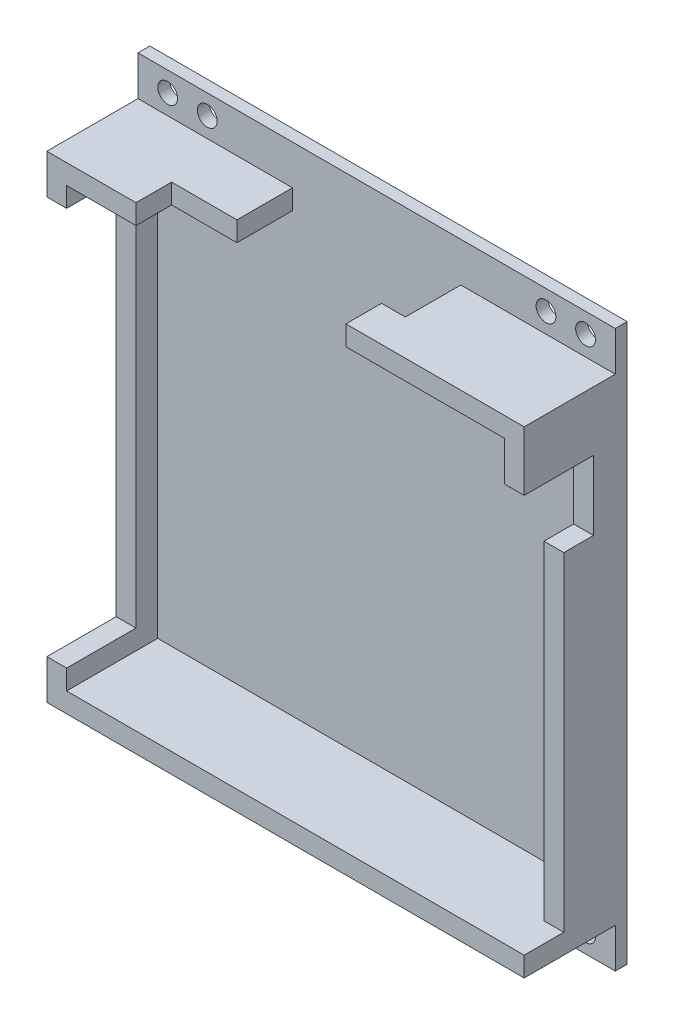
ISO-10303-21;
HEADER;
FILE_DESCRIPTION(('STEP AP214'),'2;1');
FILE_NAME('part.step','',(''),(''),'','','');
FILE_SCHEMA(('AUTOMOTIVE_DESIGN { 1 0 10303 214 1 1 1 1 }'));
ENDSEC;
DATA;
#1=APPLICATION_CONTEXT('core data for automotive mechanical design processes');
#2=APPLICATION_PROTOCOL_DEFINITION('international standard','automotive_design',2000,#1);
#3=PRODUCT_CONTEXT('',#1,'mechanical');
#4=PRODUCT('Part','Part','',(#3));
#5=PRODUCT_RELATED_PRODUCT_CATEGORY('part','',(#4));
#6=PRODUCT_DEFINITION_FORMATION('','',#4);
#7=PRODUCT_DEFINITION_CONTEXT('part definition',#1,'design');
#8=PRODUCT_DEFINITION('design','',#6,#7);
#9=PRODUCT_DEFINITION_SHAPE('','',#8);
#10=(LENGTH_UNIT() NAMED_UNIT(*) SI_UNIT(.MILLI.,.METRE.));
#11=(NAMED_UNIT(*) PLANE_ANGLE_UNIT() SI_UNIT($,.RADIAN.));
#12=(NAMED_UNIT(*) SI_UNIT($,.STERADIAN.) SOLID_ANGLE_UNIT());
#13=UNCERTAINTY_MEASURE_WITH_UNIT(LENGTH_MEASURE(1.E-05),#10,'distance_accuracy_value','');
#14=(GEOMETRIC_REPRESENTATION_CONTEXT(3) GLOBAL_UNCERTAINTY_ASSIGNED_CONTEXT((#13)) GLOBAL_UNIT_ASSIGNED_CONTEXT((#10,
#11,#12)) REPRESENTATION_CONTEXT('',''));
#15=CARTESIAN_POINT('',(0.,0.,0.));
#16=DIRECTION('',(0.,0.,1.));
#17=DIRECTION('',(1.,0.,0.));
#18=AXIS2_PLACEMENT_3D('',#15,#16,#17);
#19=CARTESIAN_POINT('',(-60.25,60.25,23.));
#20=DIRECTION('',(0.,-1.,0.));
#21=DIRECTION('',(0.,0.,-1.));
#22=AXIS2_PLACEMENT_3D('',#19,#20,#21);
#23=PLANE('',#22);
#24=DIRECTION('',(0.,0.,-1.));
#25=VECTOR('',#24,1.);
#26=CARTESIAN_POINT('',(60.25,60.25,23.));
#27=LINE('',#26,#25);
#28=CARTESIAN_POINT('',(60.25,60.25,23.));
#29=VERTEX_POINT('',#28);
#30=CARTESIAN_POINT('',(60.25,60.25,0.));
#31=VERTEX_POINT('',#30);
#32=EDGE_CURVE('E43',#29,#31,#27,.T.);
#33=ORIENTED_EDGE('',*,*,#32,.T.);
#34=DIRECTION('',(-1.,0.,0.));
#35=VECTOR('',#34,1.);
#36=CARTESIAN_POINT('',(-60.25,60.25,0.));
#37=LINE('',#36,#35);
#38=CARTESIAN_POINT('',(21.25,60.25,0.));
#39=VERTEX_POINT('',#38);
#40=EDGE_CURVE('E49',#31,#39,#37,.T.);
#41=ORIENTED_EDGE('',*,*,#40,.T.);
#42=DIRECTION('',(0.,0.,1.));
#43=VECTOR('',#42,1.);
#44=CARTESIAN_POINT('',(21.25,60.25,23.));
#45=LINE('',#44,#43);
#46=CARTESIAN_POINT('',(21.25,60.25,14.));
#47=VERTEX_POINT('',#46);
#48=EDGE_CURVE('E386',#39,#47,#45,.T.);
#49=ORIENTED_EDGE('',*,*,#48,.T.);
#50=DIRECTION('',(-1.,0.,0.));
#51=VECTOR('',#50,1.);
#52=CARTESIAN_POINT('',(-60.25,60.25,14.));
#53=LINE('',#52,#51);
#54=CARTESIAN_POINT('',(15.25,60.25,14.));
#55=VERTEX_POINT('',#54);
#56=EDGE_CURVE('E389',#47,#55,#53,.T.);
#57=ORIENTED_EDGE('',*,*,#56,.T.);
#58=DIRECTION('',(0.,0.,1.));
#59=VECTOR('',#58,1.);
#60=CARTESIAN_POINT('',(15.25,60.25,23.));
#61=LINE('',#60,#59);
#62=CARTESIAN_POINT('',(15.25,60.25,23.));
#63=VERTEX_POINT('',#62);
#64=EDGE_CURVE('E392',#55,#63,#61,.T.);
#65=ORIENTED_EDGE('',*,*,#64,.T.);
#66=DIRECTION('',(-1.,0.,0.));
#67=VECTOR('',#66,1.);
#68=CARTESIAN_POINT('',(-60.25,60.25,23.));
#69=LINE('',#68,#67);
#70=EDGE_CURVE('E463',#29,#63,#69,.T.);
#71=ORIENTED_EDGE('',*,*,#70,.F.);
#72=EDGE_LOOP('',(#33,#41,#49,#57,#65,#71));
#73=FACE_BOUND('',#72,.T.);
#74=ADVANCED_FACE('F39',(#73),#23,.F.);
#75=CARTESIAN_POINT('',(0.,0.,23.));
#76=DIRECTION('',(0.,0.,-1.));
#77=DIRECTION('',(-1.,0.,0.));
#78=AXIS2_PLACEMENT_3D('',#75,#76,#77);
#79=PLANE('',#78);
#80=DIRECTION('',(0.,1.,0.));
#81=VECTOR('',#80,1.);
#82=CARTESIAN_POINT('',(60.25,-60.25,23.));
#83=LINE('',#82,#81);
#84=CARTESIAN_POINT('',(60.25,-60.25,23.));
#85=VERTEX_POINT('',#84);
#86=CARTESIAN_POINT('',(60.25,-55.25,23.));
#87=VERTEX_POINT('',#86);
#88=EDGE_CURVE('E459',#85,#87,#83,.T.);
#89=ORIENTED_EDGE('',*,*,#88,.T.);
#90=DIRECTION('',(1.,0.,0.));
#91=VECTOR('',#90,1.);
#92=CARTESIAN_POINT('',(-55.25,-55.25,23.));
#93=LINE('',#92,#91);
#94=CARTESIAN_POINT('',(-55.25,-55.25,23.));
#95=VERTEX_POINT('',#94);
#96=EDGE_CURVE('E435',#95,#87,#93,.T.);
#97=ORIENTED_EDGE('',*,*,#96,.F.);
#98=DIRECTION('',(0.,-1.,0.));
#99=VECTOR('',#98,1.);
#100=CARTESIAN_POINT('',(-55.25,-55.25,23.));
#101=LINE('',#100,#99);
#102=CARTESIAN_POINT('',(-55.25,-50.25,23.));
#103=VERTEX_POINT('',#102);
#104=EDGE_CURVE('E431',#103,#95,#101,.T.);
#105=ORIENTED_EDGE('',*,*,#104,.F.);
#106=DIRECTION('',(1.,0.,0.));
#107=VECTOR('',#106,1.);
#108=CARTESIAN_POINT('',(-102.25,-50.25,23.));
#109=LINE('',#108,#107);
#110=CARTESIAN_POINT('',(-60.25,-50.25,23.));
#111=VERTEX_POINT('',#110);
#112=EDGE_CURVE('E407',#111,#103,#109,.T.);
#113=ORIENTED_EDGE('',*,*,#112,.F.);
#114=DIRECTION('',(0.,-1.,0.));
#115=VECTOR('',#114,1.);
#116=CARTESIAN_POINT('',(-60.25,-60.25,23.));
#117=LINE('',#116,#115);
#118=CARTESIAN_POINT('',(-60.25,-60.25,23.));
#119=VERTEX_POINT('',#118);
#120=EDGE_CURVE('E466',#111,#119,#117,.T.);
#121=ORIENTED_EDGE('',*,*,#120,.T.);
#122=DIRECTION('',(1.,0.,0.));
#123=VECTOR('',#122,1.);
#124=CARTESIAN_POINT('',(-60.25,-60.25,23.));
#125=LINE('',#124,#123);
#126=EDGE_CURVE('E470',#119,#85,#125,.T.);
#127=ORIENTED_EDGE('',*,*,#126,.T.);
#128=EDGE_LOOP('',(#89,#97,#105,#113,#121,#127));
#129=FACE_BOUND('',#128,.T.);
#130=ADVANCED_FACE('F500',(#129),#79,.F.);
#131=DIRECTION('',(0.,1.,0.));
#132=VECTOR('',#131,1.);
#133=CARTESIAN_POINT('',(55.25,-55.25,23.));
#134=LINE('',#133,#132);
#135=CARTESIAN_POINT('',(55.25,45.25,23.));
#136=VERTEX_POINT('',#135);
#137=CARTESIAN_POINT('',(55.25,55.25,23.));
#138=VERTEX_POINT('',#137);
#139=EDGE_CURVE('E424',#136,#138,#134,.T.);
#140=ORIENTED_EDGE('',*,*,#139,.F.);
#141=DIRECTION('',(-1.,0.,0.));
#142=VECTOR('',#141,1.);
#143=CARTESIAN_POINT('',(102.25,45.25,23.));
#144=LINE('',#143,#142);
#145=CARTESIAN_POINT('',(60.25,45.25,23.));
#146=VERTEX_POINT('',#145);
#147=EDGE_CURVE('E317',#146,#136,#144,.T.);
#148=ORIENTED_EDGE('',*,*,#147,.F.);
#149=EDGE_CURVE('E458',#146,#29,#83,.T.);
#150=ORIENTED_EDGE('',*,*,#149,.T.);
#151=ORIENTED_EDGE('',*,*,#70,.T.);
#152=DIRECTION('',(0.,-1.,0.));
#153=VECTOR('',#152,1.);
#154=CARTESIAN_POINT('',(15.25,102.25,23.));
#155=LINE('',#154,#153);
#156=CARTESIAN_POINT('',(15.25,55.25,23.));
#157=VERTEX_POINT('',#156);
#158=EDGE_CURVE('E360',#63,#157,#155,.T.);
#159=ORIENTED_EDGE('',*,*,#158,.T.);
#160=DIRECTION('',(-1.,0.,0.));
#161=VECTOR('',#160,1.);
#162=CARTESIAN_POINT('',(-55.25,55.25,23.));
#163=LINE('',#162,#161);
#164=EDGE_CURVE('E428',#138,#157,#163,.T.);
#165=ORIENTED_EDGE('',*,*,#164,.F.);
#166=EDGE_LOOP('',(#140,#148,#150,#151,#159,#165));
#167=FACE_BOUND('',#166,.T.);
#168=ADVANCED_FACE('F565',(#167),#79,.F.);
#169=CARTESIAN_POINT('',(-55.25,55.25,23.));
#170=DIRECTION('',(0.,-1.,0.));
#171=DIRECTION('',(0.,0.,-1.));
#172=AXIS2_PLACEMENT_3D('',#169,#170,#171);
#173=PLANE('',#172);
#174=DIRECTION('',(0.,0.,1.));
#175=VECTOR('',#174,1.);
#176=CARTESIAN_POINT('',(15.25,55.25,14.));
#177=LINE('',#176,#175);
#178=CARTESIAN_POINT('',(15.25,55.25,14.));
#179=VERTEX_POINT('',#178);
#180=EDGE_CURVE('E357',#179,#157,#177,.T.);
#181=ORIENTED_EDGE('',*,*,#180,.F.);
#182=DIRECTION('',(-1.,0.,0.));
#183=VECTOR('',#182,1.);
#184=CARTESIAN_POINT('',(15.25,55.25,14.));
#185=LINE('',#184,#183);
#186=CARTESIAN_POINT('',(21.25,55.25,14.));
#187=VERTEX_POINT('',#186);
#188=EDGE_CURVE('E354',#187,#179,#185,.T.);
#189=ORIENTED_EDGE('',*,*,#188,.F.);
#190=DIRECTION('',(0.,0.,1.));
#191=VECTOR('',#190,1.);
#192=CARTESIAN_POINT('',(21.25,55.25,14.));
#193=LINE('',#192,#191);
#194=CARTESIAN_POINT('',(21.25,55.25,0.));
#195=VERTEX_POINT('',#194);
#196=EDGE_CURVE('E351',#195,#187,#193,.T.);
#197=ORIENTED_EDGE('',*,*,#196,.F.);
#198=DIRECTION('',(-1.,0.,0.));
#199=VECTOR('',#198,1.);
#200=CARTESIAN_POINT('',(-55.25,55.25,0.));
#201=LINE('',#200,#199);
#202=CARTESIAN_POINT('',(55.25,55.25,0.));
#203=VERTEX_POINT('',#202);
#204=EDGE_CURVE('E441',#203,#195,#201,.T.);
#205=ORIENTED_EDGE('',*,*,#204,.F.);
#206=DIRECTION('',(0.,0.,-1.));
#207=VECTOR('',#206,1.);
#208=CARTESIAN_POINT('',(55.25,55.25,23.));
#209=LINE('',#208,#207);
#210=EDGE_CURVE('E455',#138,#203,#209,.T.);
#211=ORIENTED_EDGE('',*,*,#210,.F.);
#212=ORIENTED_EDGE('',*,*,#164,.T.);
#213=EDGE_LOOP('',(#181,#189,#197,#205,#211,#212));
#214=FACE_BOUND('',#213,.T.);
#215=ADVANCED_FACE('F552',(#214),#173,.T.);
#216=CARTESIAN_POINT('',(-37.75,55.25,23.));
#217=VERTEX_POINT('',#216);
#218=CARTESIAN_POINT('',(-55.25,55.25,23.));
#219=VERTEX_POINT('',#218);
#220=EDGE_CURVE('E426',#217,#219,#163,.T.);
#221=ORIENTED_EDGE('',*,*,#220,.F.);
#222=DIRECTION('',(0.,-1.,0.));
#223=VECTOR('',#222,1.);
#224=CARTESIAN_POINT('',(-37.75,102.25,23.));
#225=LINE('',#224,#223);
#226=CARTESIAN_POINT('',(-37.75,60.25,23.));
#227=VERTEX_POINT('',#226);
#228=EDGE_CURVE('E359',#227,#217,#225,.T.);
#229=ORIENTED_EDGE('',*,*,#228,.F.);
#230=CARTESIAN_POINT('',(-60.25,60.25,23.));
#231=VERTEX_POINT('',#230);
#232=EDGE_CURVE('E462',#227,#231,#69,.T.);
#233=ORIENTED_EDGE('',*,*,#232,.T.);
#234=CARTESIAN_POINT('',(-60.25,50.25,23.));
#235=VERTEX_POINT('',#234);
#236=EDGE_CURVE('E467',#231,#235,#117,.T.);
#237=ORIENTED_EDGE('',*,*,#236,.T.);
#238=DIRECTION('',(1.,0.,0.));
#239=VECTOR('',#238,1.);
#240=CARTESIAN_POINT('',(-102.25,50.25,23.));
#241=LINE('',#240,#239);
#242=CARTESIAN_POINT('',(-55.25,50.25,23.));
#243=VERTEX_POINT('',#242);
#244=EDGE_CURVE('E404',#235,#243,#241,.T.);
#245=ORIENTED_EDGE('',*,*,#244,.T.);
#246=EDGE_CURVE('E432',#219,#243,#101,.T.);
#247=ORIENTED_EDGE('',*,*,#246,.F.);
#248=EDGE_LOOP('',(#221,#229,#233,#237,#245,#247));
#249=FACE_BOUND('',#248,.T.);
#250=ADVANCED_FACE('F518',(#249),#79,.F.);
#251=CARTESIAN_POINT('',(-60.25,-60.25,23.));
#252=DIRECTION('',(1.,0.,0.));
#253=DIRECTION('',(0.,0.,-1.));
#254=AXIS2_PLACEMENT_3D('',#251,#252,#253);
#255=PLANE('',#254);
#256=DIRECTION('',(0.,0.,-1.));
#257=VECTOR('',#256,1.);
#258=CARTESIAN_POINT('',(-60.25,50.25,23.));
#259=LINE('',#258,#257);
#260=CARTESIAN_POINT('',(-60.25,50.25,5.5));
#261=VERTEX_POINT('',#260);
#262=EDGE_CURVE('E417',#235,#261,#259,.T.);
#263=ORIENTED_EDGE('',*,*,#262,.F.);
#264=ORIENTED_EDGE('',*,*,#236,.F.);
#265=DIRECTION('',(0.,0.,-1.));
#266=VECTOR('',#265,1.);
#267=CARTESIAN_POINT('',(-60.25,60.25,23.));
#268=LINE('',#267,#266);
#269=CARTESIAN_POINT('',(-60.25,60.25,0.));
#270=VERTEX_POINT('',#269);
#271=EDGE_CURVE('E255',#231,#270,#268,.T.);
#272=ORIENTED_EDGE('',*,*,#271,.T.);
#273=DIRECTION('',(0.,1.,0.));
#274=VECTOR('',#273,1.);
#275=CARTESIAN_POINT('',(-60.25,70.25,0.));
#276=LINE('',#275,#274);
#277=CARTESIAN_POINT('',(-60.25,70.25,0.));
#278=VERTEX_POINT('',#277);
#279=EDGE_CURVE('E56',#270,#278,#276,.T.);
#280=ORIENTED_EDGE('',*,*,#279,.T.);
#281=DIRECTION('',(0.,0.,-1.));
#282=VECTOR('',#281,1.);
#283=CARTESIAN_POINT('',(-60.25,70.25,0.));
#284=LINE('',#283,#282);
#285=CARTESIAN_POINT('',(-60.25,70.25,-3.));
#286=VERTEX_POINT('',#285);
#287=EDGE_CURVE('E234',#278,#286,#284,.T.);
#288=ORIENTED_EDGE('',*,*,#287,.T.);
#289=DIRECTION('',(0.,1.,0.));
#290=VECTOR('',#289,1.);
#291=CARTESIAN_POINT('',(-60.25,-60.25,-3.));
#292=LINE('',#291,#290);
#293=CARTESIAN_POINT('',(-60.25,-70.25,-3.));
#294=VERTEX_POINT('',#293);
#295=EDGE_CURVE('E419',#294,#286,#292,.T.);
#296=ORIENTED_EDGE('',*,*,#295,.F.);
#297=DIRECTION('',(0.,0.,-1.));
#298=VECTOR('',#297,1.);
#299=CARTESIAN_POINT('',(-60.25,-70.25,0.));
#300=LINE('',#299,#298);
#301=CARTESIAN_POINT('',(-60.25,-70.25,0.));
#302=VERTEX_POINT('',#301);
#303=EDGE_CURVE('E268',#302,#294,#300,.T.);
#304=ORIENTED_EDGE('',*,*,#303,.F.);
#305=DIRECTION('',(0.,1.,0.));
#306=VECTOR('',#305,1.);
#307=CARTESIAN_POINT('',(-60.25,-70.25,0.));
#308=LINE('',#307,#306);
#309=CARTESIAN_POINT('',(-60.25,-60.25,0.));
#310=VERTEX_POINT('',#309);
#311=EDGE_CURVE('E267',#302,#310,#308,.T.);
#312=ORIENTED_EDGE('',*,*,#311,.T.);
#313=DIRECTION('',(0.,0.,-1.));
#314=VECTOR('',#313,1.);
#315=CARTESIAN_POINT('',(-60.25,-60.25,23.));
#316=LINE('',#315,#314);
#317=EDGE_CURVE('E475',#119,#310,#316,.T.);
#318=ORIENTED_EDGE('',*,*,#317,.F.);
#319=ORIENTED_EDGE('',*,*,#120,.F.);
#320=DIRECTION('',(0.,0.,1.));
#321=VECTOR('',#320,1.);
#322=CARTESIAN_POINT('',(-60.25,-50.25,23.));
#323=LINE('',#322,#321);
#324=CARTESIAN_POINT('',(-60.25,-50.25,5.49999999999999));
#325=VERTEX_POINT('',#324);
#326=EDGE_CURVE('E413',#325,#111,#323,.T.);
#327=ORIENTED_EDGE('',*,*,#326,.F.);
#328=DIRECTION('',(0.,-1.,0.));
#329=VECTOR('',#328,1.);
#330=CARTESIAN_POINT('',(-60.25,-60.25,5.49999999999998));
#331=LINE('',#330,#329);
#332=EDGE_CURVE('E415',#261,#325,#331,.T.);
#333=ORIENTED_EDGE('',*,*,#332,.F.);
#334=EDGE_LOOP('',(#263,#264,#272,#280,#288,#296,#304,#312,#318,#319,#327,#333));
#335=FACE_BOUND('',#334,.T.);
#336=ADVANCED_FACE('F252',(#335),#255,.F.);
#337=CARTESIAN_POINT('',(-55.25,-55.25,23.));
#338=DIRECTION('',(1.,0.,0.));
#339=DIRECTION('',(0.,0.,-1.));
#340=AXIS2_PLACEMENT_3D('',#337,#338,#339);
#341=PLANE('',#340);
#342=ORIENTED_EDGE('',*,*,#246,.T.);
#343=DIRECTION('',(0.,0.,-1.));
#344=VECTOR('',#343,1.);
#345=CARTESIAN_POINT('',(-55.25,50.25,23.));
#346=LINE('',#345,#344);
#347=CARTESIAN_POINT('',(-55.25,50.25,5.5));
#348=VERTEX_POINT('',#347);
#349=EDGE_CURVE('E395',#243,#348,#346,.T.);
#350=ORIENTED_EDGE('',*,*,#349,.T.);
#351=DIRECTION('',(0.,-1.,0.));
#352=VECTOR('',#351,1.);
#353=CARTESIAN_POINT('',(-55.25,50.25,5.5));
#354=LINE('',#353,#352);
#355=CARTESIAN_POINT('',(-55.25,-50.25,5.49999999999999));
#356=VERTEX_POINT('',#355);
#357=EDGE_CURVE('E398',#348,#356,#354,.T.);
#358=ORIENTED_EDGE('',*,*,#357,.T.);
#359=DIRECTION('',(0.,0.,1.));
#360=VECTOR('',#359,1.);
#361=CARTESIAN_POINT('',(-55.25,-50.25,5.49999999999999));
#362=LINE('',#361,#360);
#363=EDGE_CURVE('E401',#356,#103,#362,.T.);
#364=ORIENTED_EDGE('',*,*,#363,.T.);
#365=ORIENTED_EDGE('',*,*,#104,.T.);
#366=DIRECTION('',(0.,0.,-1.));
#367=VECTOR('',#366,1.);
#368=CARTESIAN_POINT('',(-55.25,-55.25,23.));
#369=LINE('',#368,#367);
#370=CARTESIAN_POINT('',(-55.25,-55.25,0.));
#371=VERTEX_POINT('',#370);
#372=EDGE_CURVE('E449',#95,#371,#369,.T.);
#373=ORIENTED_EDGE('',*,*,#372,.T.);
#374=DIRECTION('',(0.,-1.,0.));
#375=VECTOR('',#374,1.);
#376=CARTESIAN_POINT('',(-55.25,-55.25,0.));
#377=LINE('',#376,#375);
#378=CARTESIAN_POINT('',(-55.25,55.25,0.));
#379=VERTEX_POINT('',#378);
#380=EDGE_CURVE('E444',#379,#371,#377,.T.);
#381=ORIENTED_EDGE('',*,*,#380,.F.);
#382=DIRECTION('',(0.,0.,-1.));
#383=VECTOR('',#382,1.);
#384=CARTESIAN_POINT('',(-55.25,55.25,23.));
#385=LINE('',#384,#383);
#386=EDGE_CURVE('E452',#219,#379,#385,.T.);
#387=ORIENTED_EDGE('',*,*,#386,.F.);
#388=EDGE_LOOP('',(#342,#350,#358,#364,#365,#373,#381,#387));
#389=FACE_BOUND('',#388,.T.);
#390=ADVANCED_FACE('F537',(#389),#341,.T.);
#391=CARTESIAN_POINT('',(60.25,-60.25,23.));
#392=DIRECTION('',(-1.,0.,0.));
#393=DIRECTION('',(0.,0.,1.));
#394=AXIS2_PLACEMENT_3D('',#391,#392,#393);
#395=PLANE('',#394);
#396=DIRECTION('',(0.,-1.,0.));
#397=VECTOR('',#396,1.);
#398=CARTESIAN_POINT('',(60.25,-60.25,13.));
#399=LINE('',#398,#397);
#400=CARTESIAN_POINT('',(60.25,27.75,13.));
#401=VERTEX_POINT('',#400);
#402=CARTESIAN_POINT('',(60.25,-55.25,13.));
#403=VERTEX_POINT('',#402);
#404=EDGE_CURVE('E337',#401,#403,#399,.T.);
#405=ORIENTED_EDGE('',*,*,#404,.T.);
#406=DIRECTION('',(0.,0.,1.));
#407=VECTOR('',#406,1.);
#408=CARTESIAN_POINT('',(60.25,-55.25,23.));
#409=LINE('',#408,#407);
#410=EDGE_CURVE('E340',#403,#87,#409,.T.);
#411=ORIENTED_EDGE('',*,*,#410,.T.);
#412=ORIENTED_EDGE('',*,*,#88,.F.);
#413=DIRECTION('',(0.,0.,-1.));
#414=VECTOR('',#413,1.);
#415=CARTESIAN_POINT('',(60.25,-60.25,23.));
#416=LINE('',#415,#414);
#417=CARTESIAN_POINT('',(60.25,-60.25,0.));
#418=VERTEX_POINT('',#417);
#419=EDGE_CURVE('E472',#85,#418,#416,.T.);
#420=ORIENTED_EDGE('',*,*,#419,.T.);
#421=DIRECTION('',(0.,-1.,0.));
#422=VECTOR('',#421,1.);
#423=CARTESIAN_POINT('',(60.25,-60.25,0.));
#424=LINE('',#423,#422);
#425=CARTESIAN_POINT('',(60.25,-70.25,0.));
#426=VERTEX_POINT('',#425);
#427=EDGE_CURVE('E63',#418,#426,#424,.T.);
#428=ORIENTED_EDGE('',*,*,#427,.T.);
#429=DIRECTION('',(0.,0.,-1.));
#430=VECTOR('',#429,1.);
#431=CARTESIAN_POINT('',(60.25,-70.25,0.));
#432=LINE('',#431,#430);
#433=CARTESIAN_POINT('',(60.25,-70.25,-3.));
#434=VERTEX_POINT('',#433);
#435=EDGE_CURVE('E264',#426,#434,#432,.T.);
#436=ORIENTED_EDGE('',*,*,#435,.T.);
#437=DIRECTION('',(0.,-1.,0.));
#438=VECTOR('',#437,1.);
#439=CARTESIAN_POINT('',(60.25,-60.25,-3.));
#440=LINE('',#439,#438);
#441=CARTESIAN_POINT('',(60.25,70.25,-3.));
#442=VERTEX_POINT('',#441);
#443=EDGE_CURVE('E421',#442,#434,#440,.T.);
#444=ORIENTED_EDGE('',*,*,#443,.F.);
#445=DIRECTION('',(0.,0.,-1.));
#446=VECTOR('',#445,1.);
#447=CARTESIAN_POINT('',(60.25,70.25,0.));
#448=LINE('',#447,#446);
#449=CARTESIAN_POINT('',(60.25,70.25,0.));
#450=VERTEX_POINT('',#449);
#451=EDGE_CURVE('E242',#450,#442,#448,.T.);
#452=ORIENTED_EDGE('',*,*,#451,.F.);
#453=DIRECTION('',(0.,-1.,0.));
#454=VECTOR('',#453,1.);
#455=CARTESIAN_POINT('',(60.25,60.25,0.));
#456=LINE('',#455,#454);
#457=EDGE_CURVE('E243',#450,#31,#456,.T.);
#458=ORIENTED_EDGE('',*,*,#457,.T.);
#459=ORIENTED_EDGE('',*,*,#32,.F.);
#460=ORIENTED_EDGE('',*,*,#149,.F.);
#461=DIRECTION('',(0.,0.,-1.));
#462=VECTOR('',#461,1.);
#463=CARTESIAN_POINT('',(60.25,45.25,23.));
#464=LINE('',#463,#462);
#465=CARTESIAN_POINT('',(60.25,45.25,5.5));
#466=VERTEX_POINT('',#465);
#467=EDGE_CURVE('E321',#146,#466,#464,.T.);
#468=ORIENTED_EDGE('',*,*,#467,.T.);
#469=DIRECTION('',(0.,-1.,0.));
#470=VECTOR('',#469,1.);
#471=CARTESIAN_POINT('',(60.25,-60.25,5.50000000000001));
#472=LINE('',#471,#470);
#473=CARTESIAN_POINT('',(60.25,27.75,5.5));
#474=VERTEX_POINT('',#473);
#475=EDGE_CURVE('E331',#466,#474,#472,.T.);
#476=ORIENTED_EDGE('',*,*,#475,.T.);
#477=DIRECTION('',(0.,0.,1.));
#478=VECTOR('',#477,1.);
#479=CARTESIAN_POINT('',(60.25,27.75,23.));
#480=LINE('',#479,#478);
#481=EDGE_CURVE('E334',#474,#401,#480,.T.);
#482=ORIENTED_EDGE('',*,*,#481,.T.);
#483=EDGE_LOOP('',(#405,#411,#412,#420,#428,#436,#444,#452,#458,#459,#460,#468,#476,#482));
#484=FACE_BOUND('',#483,.T.);
#485=ADVANCED_FACE('F41',(#484),#395,.F.);
#486=DIRECTION('',(0.,0.,-1.));
#487=VECTOR('',#486,1.);
#488=CARTESIAN_POINT('',(-21.25,60.25,23.));
#489=LINE('',#488,#487);
#490=CARTESIAN_POINT('',(-21.25,60.25,14.));
#491=VERTEX_POINT('',#490);
#492=CARTESIAN_POINT('',(-21.25,60.25,0.));
#493=VERTEX_POINT('',#492);
#494=EDGE_CURVE('E383',#491,#493,#489,.T.);
#495=ORIENTED_EDGE('',*,*,#494,.T.);
#496=EDGE_CURVE('E11',#493,#270,#37,.T.);
#497=ORIENTED_EDGE('',*,*,#496,.T.);
#498=ORIENTED_EDGE('',*,*,#271,.F.);
#499=ORIENTED_EDGE('',*,*,#232,.F.);
#500=DIRECTION('',(0.,0.,-1.));
#501=VECTOR('',#500,1.);
#502=CARTESIAN_POINT('',(-37.75,60.25,23.));
#503=LINE('',#502,#501);
#504=CARTESIAN_POINT('',(-37.75,60.25,14.));
#505=VERTEX_POINT('',#504);
#506=EDGE_CURVE('E363',#227,#505,#503,.T.);
#507=ORIENTED_EDGE('',*,*,#506,.T.);
#508=DIRECTION('',(1.,0.,0.));
#509=VECTOR('',#508,1.);
#510=CARTESIAN_POINT('',(-60.25,60.25,14.));
#511=LINE('',#510,#509);
#512=EDGE_CURVE('E380',#505,#491,#511,.T.);
#513=ORIENTED_EDGE('',*,*,#512,.T.);
#514=EDGE_LOOP('',(#495,#497,#498,#499,#507,#513));
#515=FACE_BOUND('',#514,.T.);
#516=ADVANCED_FACE('F523',(#515),#23,.F.);
#517=CARTESIAN_POINT('',(-60.25,-60.25,23.));
#518=DIRECTION('',(0.,1.,0.));
#519=DIRECTION('',(0.,0.,1.));
#520=AXIS2_PLACEMENT_3D('',#517,#518,#519);
#521=PLANE('',#520);
#522=ORIENTED_EDGE('',*,*,#317,.T.);
#523=DIRECTION('',(1.,0.,0.));
#524=VECTOR('',#523,1.);
#525=CARTESIAN_POINT('',(-60.25,-60.25,0.));
#526=LINE('',#525,#524);
#527=EDGE_CURVE('E275',#310,#418,#526,.T.);
#528=ORIENTED_EDGE('',*,*,#527,.T.);
#529=ORIENTED_EDGE('',*,*,#419,.F.);
#530=ORIENTED_EDGE('',*,*,#126,.F.);
#531=EDGE_LOOP('',(#522,#528,#529,#530));
#532=FACE_BOUND('',#531,.T.);
#533=ADVANCED_FACE('F496',(#532),#521,.F.);
#534=CARTESIAN_POINT('',(55.25,-55.25,23.));
#535=DIRECTION('',(-1.,0.,0.));
#536=DIRECTION('',(0.,0.,1.));
#537=AXIS2_PLACEMENT_3D('',#534,#535,#536);
#538=PLANE('',#537);
#539=DIRECTION('',(0.,-1.,0.));
#540=VECTOR('',#539,1.);
#541=CARTESIAN_POINT('',(55.25,27.75,13.));
#542=LINE('',#541,#540);
#543=CARTESIAN_POINT('',(55.25,27.75,13.));
#544=VERTEX_POINT('',#543);
#545=CARTESIAN_POINT('',(55.25,-55.25,13.));
#546=VERTEX_POINT('',#545);
#547=EDGE_CURVE('E315',#544,#546,#542,.T.);
#548=ORIENTED_EDGE('',*,*,#547,.F.);
#549=DIRECTION('',(0.,0.,1.));
#550=VECTOR('',#549,1.);
#551=CARTESIAN_POINT('',(55.25,27.75,5.5));
#552=LINE('',#551,#550);
#553=CARTESIAN_POINT('',(55.25,27.75,5.5));
#554=VERTEX_POINT('',#553);
#555=EDGE_CURVE('E312',#554,#544,#552,.T.);
#556=ORIENTED_EDGE('',*,*,#555,.F.);
#557=DIRECTION('',(0.,-1.,0.));
#558=VECTOR('',#557,1.);
#559=CARTESIAN_POINT('',(55.25,45.25,5.5));
#560=LINE('',#559,#558);
#561=CARTESIAN_POINT('',(55.25,45.25,5.5));
#562=VERTEX_POINT('',#561);
#563=EDGE_CURVE('E309',#562,#554,#560,.T.);
#564=ORIENTED_EDGE('',*,*,#563,.F.);
#565=DIRECTION('',(0.,0.,-1.));
#566=VECTOR('',#565,1.);
#567=CARTESIAN_POINT('',(55.25,45.25,23.));
#568=LINE('',#567,#566);
#569=EDGE_CURVE('E262',#136,#562,#568,.T.);
#570=ORIENTED_EDGE('',*,*,#569,.F.);
#571=ORIENTED_EDGE('',*,*,#139,.T.);
#572=ORIENTED_EDGE('',*,*,#210,.T.);
#573=DIRECTION('',(0.,1.,0.));
#574=VECTOR('',#573,1.);
#575=CARTESIAN_POINT('',(55.25,-55.25,0.));
#576=LINE('',#575,#574);
#577=CARTESIAN_POINT('',(55.25,-55.25,0.));
#578=VERTEX_POINT('',#577);
#579=EDGE_CURVE('E423',#578,#203,#576,.T.);
#580=ORIENTED_EDGE('',*,*,#579,.F.);
#581=DIRECTION('',(0.,0.,-1.));
#582=VECTOR('',#581,1.);
#583=CARTESIAN_POINT('',(55.25,-55.25,23.));
#584=LINE('',#583,#582);
#585=EDGE_CURVE('E437',#546,#578,#584,.T.);
#586=ORIENTED_EDGE('',*,*,#585,.F.);
#587=EDGE_LOOP('',(#548,#556,#564,#570,#571,#572,#580,#586));
#588=FACE_BOUND('',#587,.T.);
#589=ADVANCED_FACE('F546',(#588),#538,.T.);
#590=DIRECTION('',(0.,0.,-1.));
#591=VECTOR('',#590,1.);
#592=CARTESIAN_POINT('',(-21.25,55.25,0.));
#593=LINE('',#592,#591);
#594=CARTESIAN_POINT('',(-21.25,55.25,14.));
#595=VERTEX_POINT('',#594);
#596=CARTESIAN_POINT('',(-21.25,55.25,0.));
#597=VERTEX_POINT('',#596);
#598=EDGE_CURVE('E349',#595,#597,#593,.T.);
#599=ORIENTED_EDGE('',*,*,#598,.F.);
#600=DIRECTION('',(1.,0.,0.));
#601=VECTOR('',#600,1.);
#602=CARTESIAN_POINT('',(-37.75,55.25,14.));
#603=LINE('',#602,#601);
#604=CARTESIAN_POINT('',(-37.75,55.25,14.));
#605=VERTEX_POINT('',#604);
#606=EDGE_CURVE('E346',#605,#595,#603,.T.);
#607=ORIENTED_EDGE('',*,*,#606,.F.);
#608=DIRECTION('',(0.,0.,-1.));
#609=VECTOR('',#608,1.);
#610=CARTESIAN_POINT('',(-37.75,55.25,23.));
#611=LINE('',#610,#609);
#612=EDGE_CURVE('E343',#217,#605,#611,.T.);
#613=ORIENTED_EDGE('',*,*,#612,.F.);
#614=ORIENTED_EDGE('',*,*,#220,.T.);
#615=ORIENTED_EDGE('',*,*,#386,.T.);
#616=EDGE_CURVE('E440',#597,#379,#201,.T.);
#617=ORIENTED_EDGE('',*,*,#616,.F.);
#618=EDGE_LOOP('',(#599,#607,#613,#614,#615,#617));
#619=FACE_BOUND('',#618,.T.);
#620=ADVANCED_FACE('F532',(#619),#173,.T.);
#621=CARTESIAN_POINT('',(-55.25,-55.25,23.));
#622=DIRECTION('',(0.,1.,0.));
#623=DIRECTION('',(0.,0.,1.));
#624=AXIS2_PLACEMENT_3D('',#621,#622,#623);
#625=PLANE('',#624);
#626=DIRECTION('',(1.,0.,0.));
#627=VECTOR('',#626,1.);
#628=CARTESIAN_POINT('',(-55.25,-55.25,0.));
#629=LINE('',#628,#627);
#630=EDGE_CURVE('E427',#371,#578,#629,.T.);
#631=ORIENTED_EDGE('',*,*,#630,.F.);
#632=ORIENTED_EDGE('',*,*,#372,.F.);
#633=ORIENTED_EDGE('',*,*,#96,.T.);
#634=ORIENTED_EDGE('',*,*,#410,.F.);
#635=DIRECTION('',(-1.,0.,0.));
#636=VECTOR('',#635,1.);
#637=CARTESIAN_POINT('',(102.25,-55.25,13.));
#638=LINE('',#637,#636);
#639=EDGE_CURVE('E318',#403,#546,#638,.T.);
#640=ORIENTED_EDGE('',*,*,#639,.T.);
#641=ORIENTED_EDGE('',*,*,#585,.T.);
#642=EDGE_LOOP('',(#631,#632,#633,#634,#640,#641));
#643=FACE_BOUND('',#642,.T.);
#644=ADVANCED_FACE('F540',(#643),#625,.T.);
#645=CARTESIAN_POINT('',(0.,0.,0.));
#646=DIRECTION('',(0.,0.,1.));
#647=DIRECTION('',(1.,0.,0.));
#648=AXIS2_PLACEMENT_3D('',#645,#646,#647);
#649=PLANE('',#648);
#650=ORIENTED_EDGE('',*,*,#380,.T.);
#651=ORIENTED_EDGE('',*,*,#630,.T.);
#652=ORIENTED_EDGE('',*,*,#579,.T.);
#653=ORIENTED_EDGE('',*,*,#204,.T.);
#654=DIRECTION('',(0.,-1.,0.));
#655=VECTOR('',#654,1.);
#656=CARTESIAN_POINT('',(21.25,102.25,0.));
#657=LINE('',#656,#655);
#658=EDGE_CURVE('E368',#39,#195,#657,.T.);
#659=ORIENTED_EDGE('',*,*,#658,.F.);
#660=ORIENTED_EDGE('',*,*,#40,.F.);
#661=ORIENTED_EDGE('',*,*,#457,.F.);
#662=DIRECTION('',(1.,0.,0.));
#663=VECTOR('',#662,1.);
#664=CARTESIAN_POINT('',(60.25,70.25,0.));
#665=LINE('',#664,#663);
#666=EDGE_CURVE('E237',#278,#450,#665,.T.);
#667=ORIENTED_EDGE('',*,*,#666,.F.);
#668=ORIENTED_EDGE('',*,*,#279,.F.);
#669=ORIENTED_EDGE('',*,*,#496,.F.);
#670=DIRECTION('',(0.,-1.,0.));
#671=VECTOR('',#670,1.);
#672=CARTESIAN_POINT('',(-21.25,102.25,0.));
#673=LINE('',#672,#671);
#674=EDGE_CURVE('E370',#493,#597,#673,.T.);
#675=ORIENTED_EDGE('',*,*,#674,.T.);
#676=ORIENTED_EDGE('',*,*,#616,.T.);
#677=EDGE_LOOP('',(#650,#651,#652,#653,#659,#660,#661,#667,#668,#669,#675,#676));
#678=FACE_BOUND('',#677,.T.);
#679=CARTESIAN_POINT('',(-42.75,65.25,0.));
#680=DIRECTION('',(0.,0.,-1.));
#681=DIRECTION('',(-1.,0.,0.));
#682=AXIS2_PLACEMENT_3D('',#679,#680,#681);
#683=CIRCLE('',#682,2.5);
#684=CARTESIAN_POINT('',(-45.25,65.25,0.));
#685=VERTEX_POINT('',#684);
#686=EDGE_CURVE('E837',#685,#685,#683,.T.);
#687=ORIENTED_EDGE('',*,*,#686,.T.);
#688=EDGE_LOOP('',(#687));
#689=FACE_BOUND('',#688,.T.);
#690=CARTESIAN_POINT('',(-52.75,65.25,0.));
#691=DIRECTION('',(0.,0.,-1.));
#692=DIRECTION('',(-1.,0.,0.));
#693=AXIS2_PLACEMENT_3D('',#690,#691,#692);
#694=CIRCLE('',#693,2.5);
#695=CARTESIAN_POINT('',(-55.25,65.25,0.));
#696=VERTEX_POINT('',#695);
#697=EDGE_CURVE('E845',#696,#696,#694,.T.);
#698=ORIENTED_EDGE('',*,*,#697,.T.);
#699=EDGE_LOOP('',(#698));
#700=FACE_BOUND('',#699,.T.);
#701=CARTESIAN_POINT('',(42.75,65.25,0.));
#702=DIRECTION('',(0.,0.,-1.));
#703=DIRECTION('',(-1.,0.,0.));
#704=AXIS2_PLACEMENT_3D('',#701,#702,#703);
#705=CIRCLE('',#704,2.5);
#706=CARTESIAN_POINT('',(40.25,65.25,0.));
#707=VERTEX_POINT('',#706);
#708=EDGE_CURVE('E851',#707,#707,#705,.T.);
#709=ORIENTED_EDGE('',*,*,#708,.T.);
#710=EDGE_LOOP('',(#709));
#711=FACE_BOUND('',#710,.T.);
#712=CARTESIAN_POINT('',(52.75,65.25,0.));
#713=DIRECTION('',(0.,0.,-1.));
#714=DIRECTION('',(-1.,0.,0.));
#715=AXIS2_PLACEMENT_3D('',#712,#713,#714);
#716=CIRCLE('',#715,2.5);
#717=CARTESIAN_POINT('',(50.25,65.25,0.));
#718=VERTEX_POINT('',#717);
#719=EDGE_CURVE('E261',#718,#718,#716,.T.);
#720=ORIENTED_EDGE('',*,*,#719,.T.);
#721=EDGE_LOOP('',(#720));
#722=FACE_BOUND('',#721,.T.);
#723=ADVANCED_FACE('F246',(#678,#689,#700,#711,#722),#649,.T.);
#724=CARTESIAN_POINT('',(0.,0.,-3.));
#725=DIRECTION('',(0.,0.,1.));
#726=DIRECTION('',(1.,0.,0.));
#727=AXIS2_PLACEMENT_3D('',#724,#725,#726);
#728=PLANE('',#727);
#729=ORIENTED_EDGE('',*,*,#295,.T.);
#730=DIRECTION('',(1.,0.,0.));
#731=VECTOR('',#730,1.);
#732=CARTESIAN_POINT('',(60.25,70.25,-3.));
#733=LINE('',#732,#731);
#734=EDGE_CURVE('E240',#286,#442,#733,.T.);
#735=ORIENTED_EDGE('',*,*,#734,.T.);
#736=ORIENTED_EDGE('',*,*,#443,.T.);
#737=DIRECTION('',(-1.,0.,0.));
#738=VECTOR('',#737,1.);
#739=CARTESIAN_POINT('',(60.25,-70.25,-3.));
#740=LINE('',#739,#738);
#741=EDGE_CURVE('E271',#434,#294,#740,.T.);
#742=ORIENTED_EDGE('',*,*,#741,.T.);
#743=EDGE_LOOP('',(#729,#735,#736,#742));
#744=FACE_BOUND('',#743,.T.);
#745=CARTESIAN_POINT('',(-52.75,-65.25,-3.));
#746=DIRECTION('',(0.,0.,-1.));
#747=DIRECTION('',(-1.,0.,0.));
#748=AXIS2_PLACEMENT_3D('',#745,#746,#747);
#749=CIRCLE('',#748,2.5);
#750=CARTESIAN_POINT('',(-55.25,-65.25,-3.));
#751=VERTEX_POINT('',#750);
#752=EDGE_CURVE('E301',#751,#751,#749,.T.);
#753=ORIENTED_EDGE('',*,*,#752,.F.);
#754=EDGE_LOOP('',(#753));
#755=FACE_BOUND('',#754,.T.);
#756=CARTESIAN_POINT('',(-42.75,-65.25,-3.));
#757=DIRECTION('',(0.,0.,-1.));
#758=DIRECTION('',(-1.,0.,0.));
#759=AXIS2_PLACEMENT_3D('',#756,#757,#758);
#760=CIRCLE('',#759,2.5);
#761=CARTESIAN_POINT('',(-45.25,-65.25,-3.));
#762=VERTEX_POINT('',#761);
#763=EDGE_CURVE('E295',#762,#762,#760,.T.);
#764=ORIENTED_EDGE('',*,*,#763,.F.);
#765=EDGE_LOOP('',(#764));
#766=FACE_BOUND('',#765,.T.);
#767=CARTESIAN_POINT('',(42.75,-65.25,-3.));
#768=DIRECTION('',(0.,0.,-1.));
#769=DIRECTION('',(-1.,0.,0.));
#770=AXIS2_PLACEMENT_3D('',#767,#768,#769);
#771=CIRCLE('',#770,2.5);
#772=CARTESIAN_POINT('',(40.25,-65.25,-3.));
#773=VERTEX_POINT('',#772);
#774=EDGE_CURVE('E289',#773,#773,#771,.T.);
#775=ORIENTED_EDGE('',*,*,#774,.F.);
#776=EDGE_LOOP('',(#775));
#777=FACE_BOUND('',#776,.T.);
#778=CARTESIAN_POINT('',(52.75,-65.25,-3.));
#779=DIRECTION('',(0.,0.,-1.));
#780=DIRECTION('',(-1.,0.,0.));
#781=AXIS2_PLACEMENT_3D('',#778,#779,#780);
#782=CIRCLE('',#781,2.5);
#783=CARTESIAN_POINT('',(50.25,-65.25,-3.));
#784=VERTEX_POINT('',#783);
#785=EDGE_CURVE('E283',#784,#784,#782,.T.);
#786=ORIENTED_EDGE('',*,*,#785,.F.);
#787=EDGE_LOOP('',(#786));
#788=FACE_BOUND('',#787,.T.);
#789=CARTESIAN_POINT('',(-42.75,65.25,-3.));
#790=DIRECTION('',(0.,0.,-1.));
#791=DIRECTION('',(-1.,0.,0.));
#792=AXIS2_PLACEMENT_3D('',#789,#790,#791);
#793=CIRCLE('',#792,2.5);
#794=CARTESIAN_POINT('',(-45.25,65.25,-3.));
#795=VERTEX_POINT('',#794);
#796=EDGE_CURVE('E304',#795,#795,#793,.T.);
#797=ORIENTED_EDGE('',*,*,#796,.F.);
#798=EDGE_LOOP('',(#797));
#799=FACE_BOUND('',#798,.T.);
#800=CARTESIAN_POINT('',(-52.75,65.25,-3.));
#801=DIRECTION('',(0.,0.,-1.));
#802=DIRECTION('',(-1.,0.,0.));
#803=AXIS2_PLACEMENT_3D('',#800,#801,#802);
#804=CIRCLE('',#803,2.5);
#805=CARTESIAN_POINT('',(-55.25,65.25,-3.));
#806=VERTEX_POINT('',#805);
#807=EDGE_CURVE('E842',#806,#806,#804,.T.);
#808=ORIENTED_EDGE('',*,*,#807,.F.);
#809=EDGE_LOOP('',(#808));
#810=FACE_BOUND('',#809,.T.);
#811=CARTESIAN_POINT('',(42.75,65.25,-3.));
#812=DIRECTION('',(0.,0.,-1.));
#813=DIRECTION('',(-1.,0.,0.));
#814=AXIS2_PLACEMENT_3D('',#811,#812,#813);
#815=CIRCLE('',#814,2.5);
#816=CARTESIAN_POINT('',(40.25,65.25,-3.));
#817=VERTEX_POINT('',#816);
#818=EDGE_CURVE('E848',#817,#817,#815,.T.);
#819=ORIENTED_EDGE('',*,*,#818,.F.);
#820=EDGE_LOOP('',(#819));
#821=FACE_BOUND('',#820,.T.);
#822=CARTESIAN_POINT('',(52.75,65.25,-3.));
#823=DIRECTION('',(0.,0.,-1.));
#824=DIRECTION('',(-1.,0.,0.));
#825=AXIS2_PLACEMENT_3D('',#822,#823,#824);
#826=CIRCLE('',#825,2.5);
#827=CARTESIAN_POINT('',(50.25,65.25,-3.));
#828=VERTEX_POINT('',#827);
#829=EDGE_CURVE('E854',#828,#828,#826,.T.);
#830=ORIENTED_EDGE('',*,*,#829,.F.);
#831=EDGE_LOOP('',(#830));
#832=FACE_BOUND('',#831,.T.);
#833=ADVANCED_FACE('F485',(#744,#755,#766,#777,#788,#799,#810,#821,#832),#728,.F.);
#834=CARTESIAN_POINT('',(-102.25,50.25,23.));
#835=DIRECTION('',(0.,-1.,0.));
#836=DIRECTION('',(0.,0.,-1.));
#837=AXIS2_PLACEMENT_3D('',#834,#835,#836);
#838=PLANE('',#837);
#839=ORIENTED_EDGE('',*,*,#262,.T.);
#840=DIRECTION('',(1.,0.,0.));
#841=VECTOR('',#840,1.);
#842=CARTESIAN_POINT('',(-102.25,50.25,5.5));
#843=LINE('',#842,#841);
#844=EDGE_CURVE('E411',#261,#348,#843,.T.);
#845=ORIENTED_EDGE('',*,*,#844,.T.);
#846=ORIENTED_EDGE('',*,*,#349,.F.);
#847=ORIENTED_EDGE('',*,*,#244,.F.);
#848=EDGE_LOOP('',(#839,#845,#846,#847));
#849=FACE_BOUND('',#848,.T.);
#850=ADVANCED_FACE('F515',(#849),#838,.T.);
#851=CARTESIAN_POINT('',(-102.25,50.25,5.5));
#852=DIRECTION('',(0.,0.,1.));
#853=DIRECTION('',(0.,-1.,0.));
#854=AXIS2_PLACEMENT_3D('',#851,#852,#853);
#855=PLANE('',#854);
#856=ORIENTED_EDGE('',*,*,#332,.T.);
#857=DIRECTION('',(1.,0.,0.));
#858=VECTOR('',#857,1.);
#859=CARTESIAN_POINT('',(-102.25,-50.25,5.49999999999999));
#860=LINE('',#859,#858);
#861=EDGE_CURVE('E409',#325,#356,#860,.T.);
#862=ORIENTED_EDGE('',*,*,#861,.T.);
#863=ORIENTED_EDGE('',*,*,#357,.F.);
#864=ORIENTED_EDGE('',*,*,#844,.F.);
#865=EDGE_LOOP('',(#856,#862,#863,#864));
#866=FACE_BOUND('',#865,.T.);
#867=ADVANCED_FACE('F512',(#866),#855,.T.);
#868=CARTESIAN_POINT('',(-102.25,-50.25,5.49999999999999));
#869=DIRECTION('',(0.,1.,0.));
#870=DIRECTION('',(0.,0.,1.));
#871=AXIS2_PLACEMENT_3D('',#868,#869,#870);
#872=PLANE('',#871);
#873=ORIENTED_EDGE('',*,*,#326,.T.);
#874=ORIENTED_EDGE('',*,*,#112,.T.);
#875=ORIENTED_EDGE('',*,*,#363,.F.);
#876=ORIENTED_EDGE('',*,*,#861,.F.);
#877=EDGE_LOOP('',(#873,#874,#875,#876));
#878=FACE_BOUND('',#877,.T.);
#879=ADVANCED_FACE('F508',(#878),#872,.T.);
#880=CARTESIAN_POINT('',(15.25,102.25,14.));
#881=DIRECTION('',(1.,0.,0.));
#882=DIRECTION('',(0.,0.,-1.));
#883=AXIS2_PLACEMENT_3D('',#880,#881,#882);
#884=PLANE('',#883);
#885=DIRECTION('',(0.,-1.,0.));
#886=VECTOR('',#885,1.);
#887=CARTESIAN_POINT('',(15.25,102.25,14.));
#888=LINE('',#887,#886);
#889=EDGE_CURVE('E364',#55,#179,#888,.T.);
#890=ORIENTED_EDGE('',*,*,#889,.T.);
#891=ORIENTED_EDGE('',*,*,#180,.T.);
#892=ORIENTED_EDGE('',*,*,#158,.F.);
#893=ORIENTED_EDGE('',*,*,#64,.F.);
#894=EDGE_LOOP('',(#890,#891,#892,#893));
#895=FACE_BOUND('',#894,.T.);
#896=ADVANCED_FACE('F562',(#895),#884,.F.);
#897=CARTESIAN_POINT('',(15.25,102.25,14.));
#898=DIRECTION('',(0.,0.,1.));
#899=DIRECTION('',(1.,0.,0.));
#900=AXIS2_PLACEMENT_3D('',#897,#898,#899);
#901=PLANE('',#900);
#902=DIRECTION('',(0.,-1.,0.));
#903=VECTOR('',#902,1.);
#904=CARTESIAN_POINT('',(21.25,102.25,14.));
#905=LINE('',#904,#903);
#906=EDGE_CURVE('E366',#47,#187,#905,.T.);
#907=ORIENTED_EDGE('',*,*,#906,.T.);
#908=ORIENTED_EDGE('',*,*,#188,.T.);
#909=ORIENTED_EDGE('',*,*,#889,.F.);
#910=ORIENTED_EDGE('',*,*,#56,.F.);
#911=EDGE_LOOP('',(#907,#908,#909,#910));
#912=FACE_BOUND('',#911,.T.);
#913=ADVANCED_FACE('F560',(#912),#901,.F.);
#914=CARTESIAN_POINT('',(21.25,102.25,14.));
#915=DIRECTION('',(1.,0.,0.));
#916=DIRECTION('',(0.,0.,-1.));
#917=AXIS2_PLACEMENT_3D('',#914,#915,#916);
#918=PLANE('',#917);
#919=ORIENTED_EDGE('',*,*,#658,.T.);
#920=ORIENTED_EDGE('',*,*,#196,.T.);
#921=ORIENTED_EDGE('',*,*,#906,.F.);
#922=ORIENTED_EDGE('',*,*,#48,.F.);
#923=EDGE_LOOP('',(#919,#920,#921,#922));
#924=FACE_BOUND('',#923,.T.);
#925=ADVANCED_FACE('F557',(#924),#918,.F.);
#926=CARTESIAN_POINT('',(-21.25,102.25,0.));
#927=DIRECTION('',(-1.,0.,0.));
#928=DIRECTION('',(0.,0.,1.));
#929=AXIS2_PLACEMENT_3D('',#926,#927,#928);
#930=PLANE('',#929);
#931=DIRECTION('',(0.,-1.,0.));
#932=VECTOR('',#931,1.);
#933=CARTESIAN_POINT('',(-21.25,102.25,14.));
#934=LINE('',#933,#932);
#935=EDGE_CURVE('E373',#491,#595,#934,.T.);
#936=ORIENTED_EDGE('',*,*,#935,.T.);
#937=ORIENTED_EDGE('',*,*,#598,.T.);
#938=ORIENTED_EDGE('',*,*,#674,.F.);
#939=ORIENTED_EDGE('',*,*,#494,.F.);
#940=EDGE_LOOP('',(#936,#937,#938,#939));
#941=FACE_BOUND('',#940,.T.);
#942=ADVANCED_FACE('F527',(#941),#930,.F.);
#943=CARTESIAN_POINT('',(-37.75,102.25,14.));
#944=DIRECTION('',(0.,0.,-1.));
#945=DIRECTION('',(-1.,0.,0.));
#946=AXIS2_PLACEMENT_3D('',#943,#944,#945);
#947=PLANE('',#946);
#948=DIRECTION('',(0.,-1.,0.));
#949=VECTOR('',#948,1.);
#950=CARTESIAN_POINT('',(-37.75,102.25,14.));
#951=LINE('',#950,#949);
#952=EDGE_CURVE('E375',#505,#605,#951,.T.);
#953=ORIENTED_EDGE('',*,*,#952,.T.);
#954=ORIENTED_EDGE('',*,*,#606,.T.);
#955=ORIENTED_EDGE('',*,*,#935,.F.);
#956=ORIENTED_EDGE('',*,*,#512,.F.);
#957=EDGE_LOOP('',(#953,#954,#955,#956));
#958=FACE_BOUND('',#957,.T.);
#959=ADVANCED_FACE('F590',(#958),#947,.F.);
#960=CARTESIAN_POINT('',(-37.75,102.25,23.));
#961=DIRECTION('',(-1.,0.,0.));
#962=DIRECTION('',(0.,0.,1.));
#963=AXIS2_PLACEMENT_3D('',#960,#961,#962);
#964=PLANE('',#963);
#965=ORIENTED_EDGE('',*,*,#228,.T.);
#966=ORIENTED_EDGE('',*,*,#612,.T.);
#967=ORIENTED_EDGE('',*,*,#952,.F.);
#968=ORIENTED_EDGE('',*,*,#506,.F.);
#969=EDGE_LOOP('',(#965,#966,#967,#968));
#970=FACE_BOUND('',#969,.T.);
#971=ADVANCED_FACE('F582',(#970),#964,.F.);
#972=CARTESIAN_POINT('',(102.25,27.75,13.));
#973=DIRECTION('',(0.,0.,-1.));
#974=DIRECTION('',(0.,1.,0.));
#975=AXIS2_PLACEMENT_3D('',#972,#973,#974);
#976=PLANE('',#975);
#977=DIRECTION('',(-1.,0.,0.));
#978=VECTOR('',#977,1.);
#979=CARTESIAN_POINT('',(102.25,27.75,13.));
#980=LINE('',#979,#978);
#981=EDGE_CURVE('E322',#401,#544,#980,.T.);
#982=ORIENTED_EDGE('',*,*,#981,.T.);
#983=ORIENTED_EDGE('',*,*,#547,.T.);
#984=ORIENTED_EDGE('',*,*,#639,.F.);
#985=ORIENTED_EDGE('',*,*,#404,.F.);
#986=EDGE_LOOP('',(#982,#983,#984,#985));
#987=FACE_BOUND('',#986,.T.);
#988=ADVANCED_FACE('F580',(#987),#976,.F.);
#989=CARTESIAN_POINT('',(102.25,27.75,5.5));
#990=DIRECTION('',(0.,-1.,0.));
#991=DIRECTION('',(0.,0.,-1.));
#992=AXIS2_PLACEMENT_3D('',#989,#990,#991);
#993=PLANE('',#992);
#994=DIRECTION('',(-1.,0.,0.));
#995=VECTOR('',#994,1.);
#996=CARTESIAN_POINT('',(102.25,27.75,5.5));
#997=LINE('',#996,#995);
#998=EDGE_CURVE('E324',#474,#554,#997,.T.);
#999=ORIENTED_EDGE('',*,*,#998,.T.);
#1000=ORIENTED_EDGE('',*,*,#555,.T.);
#1001=ORIENTED_EDGE('',*,*,#981,.F.);
#1002=ORIENTED_EDGE('',*,*,#481,.F.);
#1003=EDGE_LOOP('',(#999,#1000,#1001,#1002));
#1004=FACE_BOUND('',#1003,.T.);
#1005=ADVANCED_FACE('F578',(#1004),#993,.F.);
#1006=CARTESIAN_POINT('',(102.25,45.25,5.5));
#1007=DIRECTION('',(0.,0.,-1.));
#1008=DIRECTION('',(0.,1.,0.));
#1009=AXIS2_PLACEMENT_3D('',#1006,#1007,#1008);
#1010=PLANE('',#1009);
#1011=DIRECTION('',(-1.,0.,0.));
#1012=VECTOR('',#1011,1.);
#1013=CARTESIAN_POINT('',(102.25,45.25,5.5));
#1014=LINE('',#1013,#1012);
#1015=EDGE_CURVE('E326',#466,#562,#1014,.T.);
#1016=ORIENTED_EDGE('',*,*,#1015,.T.);
#1017=ORIENTED_EDGE('',*,*,#563,.T.);
#1018=ORIENTED_EDGE('',*,*,#998,.F.);
#1019=ORIENTED_EDGE('',*,*,#475,.F.);
#1020=EDGE_LOOP('',(#1016,#1017,#1018,#1019));
#1021=FACE_BOUND('',#1020,.T.);
#1022=ADVANCED_FACE('F575',(#1021),#1010,.F.);
#1023=CARTESIAN_POINT('',(102.25,45.25,23.));
#1024=DIRECTION('',(0.,1.,0.));
#1025=DIRECTION('',(0.,0.,1.));
#1026=AXIS2_PLACEMENT_3D('',#1023,#1024,#1025);
#1027=PLANE('',#1026);
#1028=ORIENTED_EDGE('',*,*,#147,.T.);
#1029=ORIENTED_EDGE('',*,*,#569,.T.);
#1030=ORIENTED_EDGE('',*,*,#1015,.F.);
#1031=ORIENTED_EDGE('',*,*,#467,.F.);
#1032=EDGE_LOOP('',(#1028,#1029,#1030,#1031));
#1033=FACE_BOUND('',#1032,.T.);
#1034=ADVANCED_FACE('F569',(#1033),#1027,.F.);
#1035=CARTESIAN_POINT('',(60.25,-70.25,0.));
#1036=DIRECTION('',(0.,-1.,0.));
#1037=DIRECTION('',(0.,0.,-1.));
#1038=AXIS2_PLACEMENT_3D('',#1035,#1036,#1037);
#1039=PLANE('',#1038);
#1040=ORIENTED_EDGE('',*,*,#741,.F.);
#1041=ORIENTED_EDGE('',*,*,#435,.F.);
#1042=DIRECTION('',(-1.,0.,0.));
#1043=VECTOR('',#1042,1.);
#1044=CARTESIAN_POINT('',(60.25,-70.25,0.));
#1045=LINE('',#1044,#1043);
#1046=EDGE_CURVE('E278',#426,#302,#1045,.T.);
#1047=ORIENTED_EDGE('',*,*,#1046,.T.);
#1048=ORIENTED_EDGE('',*,*,#303,.T.);
#1049=EDGE_LOOP('',(#1040,#1041,#1047,#1048));
#1050=FACE_BOUND('',#1049,.T.);
#1051=ADVANCED_FACE('F489',(#1050),#1039,.T.);
#1052=CARTESIAN_POINT('',(0.,0.,0.));
#1053=DIRECTION('',(0.,0.,-1.));
#1054=DIRECTION('',(-1.,0.,0.));
#1055=AXIS2_PLACEMENT_3D('',#1052,#1053,#1054);
#1056=PLANE('',#1055);
#1057=CARTESIAN_POINT('',(-52.75,-65.25,0.));
#1058=DIRECTION('',(0.,0.,-1.));
#1059=DIRECTION('',(-1.,0.,0.));
#1060=AXIS2_PLACEMENT_3D('',#1057,#1058,#1059);
#1061=CIRCLE('',#1060,2.5);
#1062=CARTESIAN_POINT('',(-55.25,-65.25,0.));
#1063=VERTEX_POINT('',#1062);
#1064=EDGE_CURVE('E298',#1063,#1063,#1061,.T.);
#1065=ORIENTED_EDGE('',*,*,#1064,.T.);
#1066=EDGE_LOOP('',(#1065));
#1067=FACE_BOUND('',#1066,.T.);
#1068=CARTESIAN_POINT('',(-42.75,-65.25,0.));
#1069=DIRECTION('',(0.,0.,-1.));
#1070=DIRECTION('',(-1.,0.,0.));
#1071=AXIS2_PLACEMENT_3D('',#1068,#1069,#1070);
#1072=CIRCLE('',#1071,2.5);
#1073=CARTESIAN_POINT('',(-45.25,-65.25,0.));
#1074=VERTEX_POINT('',#1073);
#1075=EDGE_CURVE('E292',#1074,#1074,#1072,.T.);
#1076=ORIENTED_EDGE('',*,*,#1075,.T.);
#1077=EDGE_LOOP('',(#1076));
#1078=FACE_BOUND('',#1077,.T.);
#1079=CARTESIAN_POINT('',(42.75,-65.25,0.));
#1080=DIRECTION('',(0.,0.,-1.));
#1081=DIRECTION('',(-1.,0.,0.));
#1082=AXIS2_PLACEMENT_3D('',#1079,#1080,#1081);
#1083=CIRCLE('',#1082,2.5);
#1084=CARTESIAN_POINT('',(40.25,-65.25,0.));
#1085=VERTEX_POINT('',#1084);
#1086=EDGE_CURVE('E286',#1085,#1085,#1083,.T.);
#1087=ORIENTED_EDGE('',*,*,#1086,.T.);
#1088=EDGE_LOOP('',(#1087));
#1089=FACE_BOUND('',#1088,.T.);
#1090=CARTESIAN_POINT('',(52.75,-65.25,0.));
#1091=DIRECTION('',(0.,0.,-1.));
#1092=DIRECTION('',(-1.,0.,0.));
#1093=AXIS2_PLACEMENT_3D('',#1090,#1091,#1092);
#1094=CIRCLE('',#1093,2.5);
#1095=CARTESIAN_POINT('',(50.25,-65.25,0.));
#1096=VERTEX_POINT('',#1095);
#1097=EDGE_CURVE('E274',#1096,#1096,#1094,.T.);
#1098=ORIENTED_EDGE('',*,*,#1097,.T.);
#1099=EDGE_LOOP('',(#1098));
#1100=FACE_BOUND('',#1099,.T.);
#1101=ORIENTED_EDGE('',*,*,#527,.F.);
#1102=ORIENTED_EDGE('',*,*,#311,.F.);
#1103=ORIENTED_EDGE('',*,*,#1046,.F.);
#1104=ORIENTED_EDGE('',*,*,#427,.F.);
#1105=EDGE_LOOP('',(#1101,#1102,#1103,#1104));
#1106=FACE_BOUND('',#1105,.T.);
#1107=ADVANCED_FACE('F491',(#1067,#1078,#1089,#1100,#1106),#1056,.F.);
#1108=CARTESIAN_POINT('',(52.75,-65.25,0.));
#1109=DIRECTION('',(0.,0.,-1.));
#1110=DIRECTION('',(-1.,0.,0.));
#1111=AXIS2_PLACEMENT_3D('',#1108,#1109,#1110);
#1112=CYLINDRICAL_SURFACE('',#1111,2.5);
#1113=ORIENTED_EDGE('',*,*,#1097,.F.);
#1114=EDGE_LOOP('',(#1113));
#1115=FACE_BOUND('',#1114,.T.);
#1116=ORIENTED_EDGE('',*,*,#785,.T.);
#1117=EDGE_LOOP('',(#1116));
#1118=FACE_BOUND('',#1117,.T.);
#1119=ADVANCED_FACE('F744',(#1115,#1118),#1112,.F.);
#1120=CARTESIAN_POINT('',(42.75,-65.25,0.));
#1121=DIRECTION('',(0.,0.,-1.));
#1122=DIRECTION('',(-1.,0.,0.));
#1123=AXIS2_PLACEMENT_3D('',#1120,#1121,#1122);
#1124=CYLINDRICAL_SURFACE('',#1123,2.5);
#1125=ORIENTED_EDGE('',*,*,#1086,.F.);
#1126=EDGE_LOOP('',(#1125));
#1127=FACE_BOUND('',#1126,.T.);
#1128=ORIENTED_EDGE('',*,*,#774,.T.);
#1129=EDGE_LOOP('',(#1128));
#1130=FACE_BOUND('',#1129,.T.);
#1131=ADVANCED_FACE('F754',(#1127,#1130),#1124,.F.);
#1132=CARTESIAN_POINT('',(-42.75,-65.25,0.));
#1133=DIRECTION('',(0.,0.,-1.));
#1134=DIRECTION('',(-1.,0.,0.));
#1135=AXIS2_PLACEMENT_3D('',#1132,#1133,#1134);
#1136=CYLINDRICAL_SURFACE('',#1135,2.5);
#1137=ORIENTED_EDGE('',*,*,#1075,.F.);
#1138=EDGE_LOOP('',(#1137));
#1139=FACE_BOUND('',#1138,.T.);
#1140=ORIENTED_EDGE('',*,*,#763,.T.);
#1141=EDGE_LOOP('',(#1140));
#1142=FACE_BOUND('',#1141,.T.);
#1143=ADVANCED_FACE('F764',(#1139,#1142),#1136,.F.);
#1144=CARTESIAN_POINT('',(-52.75,-65.25,0.));
#1145=DIRECTION('',(0.,0.,-1.));
#1146=DIRECTION('',(-1.,0.,0.));
#1147=AXIS2_PLACEMENT_3D('',#1144,#1145,#1146);
#1148=CYLINDRICAL_SURFACE('',#1147,2.5);
#1149=ORIENTED_EDGE('',*,*,#1064,.F.);
#1150=EDGE_LOOP('',(#1149));
#1151=FACE_BOUND('',#1150,.T.);
#1152=ORIENTED_EDGE('',*,*,#752,.T.);
#1153=EDGE_LOOP('',(#1152));
#1154=FACE_BOUND('',#1153,.T.);
#1155=ADVANCED_FACE('F774',(#1151,#1154),#1148,.F.);
#1156=CARTESIAN_POINT('',(60.25,70.25,0.));
#1157=DIRECTION('',(0.,1.,0.));
#1158=DIRECTION('',(0.,0.,1.));
#1159=AXIS2_PLACEMENT_3D('',#1156,#1157,#1158);
#1160=PLANE('',#1159);
#1161=ORIENTED_EDGE('',*,*,#734,.F.);
#1162=ORIENTED_EDGE('',*,*,#287,.F.);
#1163=ORIENTED_EDGE('',*,*,#666,.T.);
#1164=ORIENTED_EDGE('',*,*,#451,.T.);
#1165=EDGE_LOOP('',(#1161,#1162,#1163,#1164));
#1166=FACE_BOUND('',#1165,.T.);
#1167=ADVANCED_FACE('F235',(#1166),#1160,.T.);
#1168=CARTESIAN_POINT('',(52.75,65.25,0.));
#1169=DIRECTION('',(0.,0.,-1.));
#1170=DIRECTION('',(-1.,0.,0.));
#1171=AXIS2_PLACEMENT_3D('',#1168,#1169,#1170);
#1172=CYLINDRICAL_SURFACE('',#1171,2.5);
#1173=ORIENTED_EDGE('',*,*,#719,.F.);
#1174=EDGE_LOOP('',(#1173));
#1175=FACE_BOUND('',#1174,.T.);
#1176=ORIENTED_EDGE('',*,*,#829,.T.);
#1177=EDGE_LOOP('',(#1176));
#1178=FACE_BOUND('',#1177,.T.);
#1179=ADVANCED_FACE('F792',(#1175,#1178),#1172,.F.);
#1180=CARTESIAN_POINT('',(42.75,65.25,0.));
#1181=DIRECTION('',(0.,0.,-1.));
#1182=DIRECTION('',(-1.,0.,0.));
#1183=AXIS2_PLACEMENT_3D('',#1180,#1181,#1182);
#1184=CYLINDRICAL_SURFACE('',#1183,2.5);
#1185=ORIENTED_EDGE('',*,*,#708,.F.);
#1186=EDGE_LOOP('',(#1185));
#1187=FACE_BOUND('',#1186,.T.);
#1188=ORIENTED_EDGE('',*,*,#818,.T.);
#1189=EDGE_LOOP('',(#1188));
#1190=FACE_BOUND('',#1189,.T.);
#1191=ADVANCED_FACE('F801',(#1187,#1190),#1184,.F.);
#1192=CARTESIAN_POINT('',(-52.75,65.25,0.));
#1193=DIRECTION('',(0.,0.,-1.));
#1194=DIRECTION('',(-1.,0.,0.));
#1195=AXIS2_PLACEMENT_3D('',#1192,#1193,#1194);
#1196=CYLINDRICAL_SURFACE('',#1195,2.5);
#1197=ORIENTED_EDGE('',*,*,#697,.F.);
#1198=EDGE_LOOP('',(#1197));
#1199=FACE_BOUND('',#1198,.T.);
#1200=ORIENTED_EDGE('',*,*,#807,.T.);
#1201=EDGE_LOOP('',(#1200));
#1202=FACE_BOUND('',#1201,.T.);
#1203=ADVANCED_FACE('F811',(#1199,#1202),#1196,.F.);
#1204=CARTESIAN_POINT('',(-42.75,65.25,0.));
#1205=DIRECTION('',(0.,0.,-1.));
#1206=DIRECTION('',(-1.,0.,0.));
#1207=AXIS2_PLACEMENT_3D('',#1204,#1205,#1206);
#1208=CYLINDRICAL_SURFACE('',#1207,2.5);
#1209=ORIENTED_EDGE('',*,*,#686,.F.);
#1210=EDGE_LOOP('',(#1209));
#1211=FACE_BOUND('',#1210,.T.);
#1212=ORIENTED_EDGE('',*,*,#796,.T.);
#1213=EDGE_LOOP('',(#1212));
#1214=FACE_BOUND('',#1213,.T.);
#1215=ADVANCED_FACE('F821',(#1211,#1214),#1208,.F.);
#1216=CLOSED_SHELL('',(#74,#130,#168,#215,#250,#336,#390,#485,#516,#533,#589,#620,#644,#723,
#833,#850,#867,#879,#896,#913,#925,#942,#959,#971,#988,#1005,#1022,#1034,#1051,#1107,#1119,
#1131,#1143,#1155,#1167,#1179,#1191,#1203,#1215));
#1217=MANIFOLD_SOLID_BREP('B2',#1216);
#1218=ADVANCED_BREP_SHAPE_REPRESENTATION('',(#18,#1217),#14);
#1219=SHAPE_DEFINITION_REPRESENTATION(#9,#1218);
ENDSEC;
END-ISO-10303-21;
